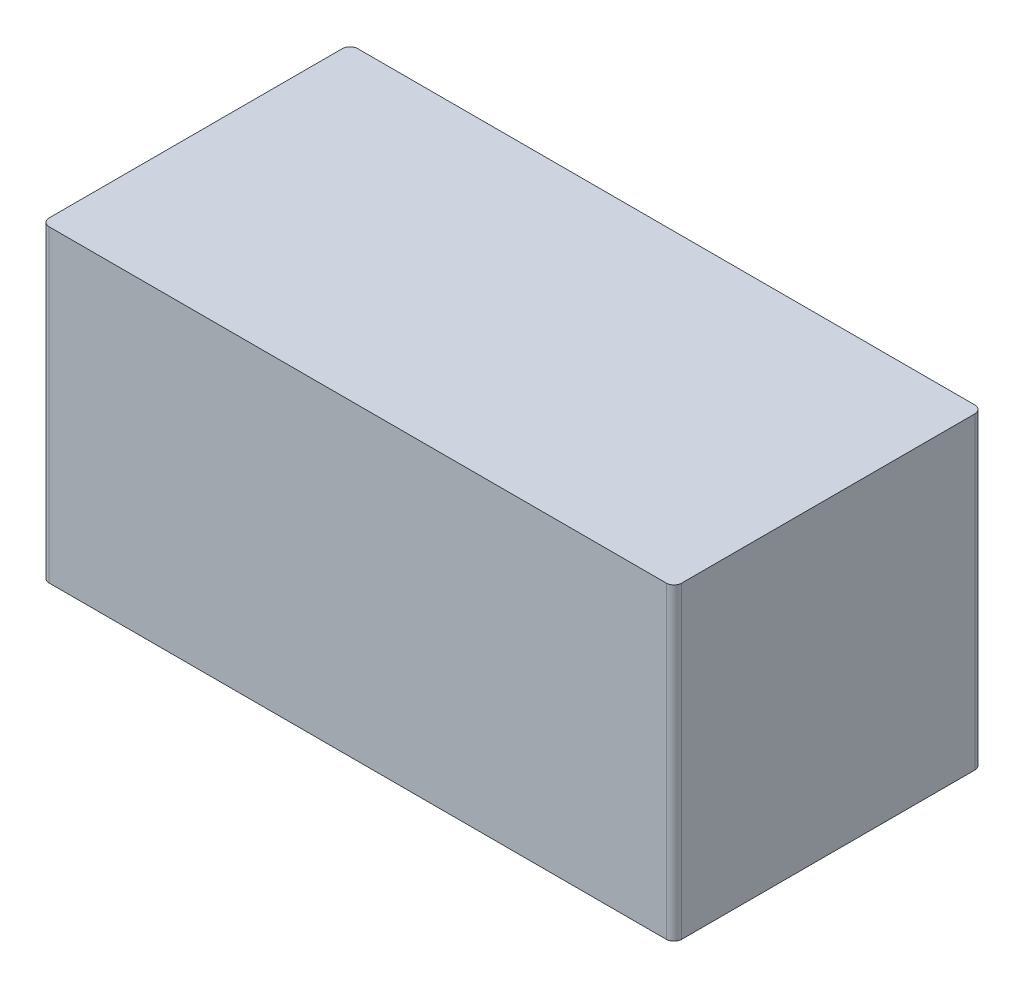
ISO-10303-21;
HEADER;
FILE_DESCRIPTION(('STEP AP214'),'2;1');
FILE_NAME('part.step','',(''),(''),'','','');
FILE_SCHEMA(('AUTOMOTIVE_DESIGN { 1 0 10303 214 1 1 1 1 }'));
ENDSEC;
DATA;
#1=APPLICATION_CONTEXT('core data for automotive mechanical design processes');
#2=APPLICATION_PROTOCOL_DEFINITION('international standard','automotive_design',2000,#1);
#3=PRODUCT_CONTEXT('',#1,'mechanical');
#4=PRODUCT('Part','Part','',(#3));
#5=PRODUCT_RELATED_PRODUCT_CATEGORY('part','',(#4));
#6=PRODUCT_DEFINITION_FORMATION('','',#4);
#7=PRODUCT_DEFINITION_CONTEXT('part definition',#1,'design');
#8=PRODUCT_DEFINITION('design','',#6,#7);
#9=PRODUCT_DEFINITION_SHAPE('','',#8);
#10=(LENGTH_UNIT() NAMED_UNIT(*) SI_UNIT(.MILLI.,.METRE.));
#11=(NAMED_UNIT(*) PLANE_ANGLE_UNIT() SI_UNIT($,.RADIAN.));
#12=(NAMED_UNIT(*) SI_UNIT($,.STERADIAN.) SOLID_ANGLE_UNIT());
#13=UNCERTAINTY_MEASURE_WITH_UNIT(LENGTH_MEASURE(1.E-05),#10,'distance_accuracy_value','');
#14=(GEOMETRIC_REPRESENTATION_CONTEXT(3) GLOBAL_UNCERTAINTY_ASSIGNED_CONTEXT((#13)) GLOBAL_UNIT_ASSIGNED_CONTEXT((#10,
#11,#12)) REPRESENTATION_CONTEXT('',''));
#15=CARTESIAN_POINT('',(0.,0.,0.));
#16=DIRECTION('',(0.,0.,1.));
#17=DIRECTION('',(1.,0.,0.));
#18=AXIS2_PLACEMENT_3D('',#15,#16,#17);
#19=CARTESIAN_POINT('',(0.,20.,-20.));
#20=DIRECTION('',(1.,0.,0.));
#21=DIRECTION('',(0.,0.,-1.));
#22=AXIS2_PLACEMENT_3D('',#19,#20,#21);
#23=PLANE('',#22);
#24=DIRECTION('',(0.,0.,1.));
#25=VECTOR('',#24,1.);
#26=CARTESIAN_POINT('',(0.,20.,-20.));
#27=LINE('',#26,#25);
#28=CARTESIAN_POINT('',(0.,20.,-19.5));
#29=VERTEX_POINT('',#28);
#30=CARTESIAN_POINT('',(0.,20.,-0.5));
#31=VERTEX_POINT('',#30);
#32=EDGE_CURVE('E117',#29,#31,#27,.T.);
#33=ORIENTED_EDGE('',*,*,#32,.F.);
#34=DIRECTION('',(0.,-1.,0.));
#35=VECTOR('',#34,1.);
#36=CARTESIAN_POINT('',(0.,20.,-19.5));
#37=LINE('',#36,#35);
#38=CARTESIAN_POINT('',(0.,0.,-19.5));
#39=VERTEX_POINT('',#38);
#40=EDGE_CURVE('E102',#29,#39,#37,.T.);
#41=ORIENTED_EDGE('',*,*,#40,.T.);
#42=DIRECTION('',(0.,0.,1.));
#43=VECTOR('',#42,1.);
#44=CARTESIAN_POINT('',(0.,0.,-20.));
#45=LINE('',#44,#43);
#46=CARTESIAN_POINT('',(0.,0.,-0.5));
#47=VERTEX_POINT('',#46);
#48=EDGE_CURVE('E114',#39,#47,#45,.T.);
#49=ORIENTED_EDGE('',*,*,#48,.T.);
#50=DIRECTION('',(0.,-1.,0.));
#51=VECTOR('',#50,1.);
#52=CARTESIAN_POINT('',(0.,20.,-0.5));
#53=LINE('',#52,#51);
#54=EDGE_CURVE('E119',#47,#31,#53,.F.);
#55=ORIENTED_EDGE('',*,*,#54,.T.);
#56=EDGE_LOOP('',(#33,#41,#49,#55));
#57=FACE_BOUND('',#56,.T.);
#58=ADVANCED_FACE('F33',(#57),#23,.F.);
#59=CARTESIAN_POINT('',(0.,20.,0.));
#60=DIRECTION('',(0.,0.,-1.));
#61=DIRECTION('',(-1.,0.,0.));
#62=AXIS2_PLACEMENT_3D('',#59,#60,#61);
#63=PLANE('',#62);
#64=DIRECTION('',(1.,0.,0.));
#65=VECTOR('',#64,1.);
#66=CARTESIAN_POINT('',(0.,20.,0.));
#67=LINE('',#66,#65);
#68=CARTESIAN_POINT('',(0.5,20.,0.));
#69=VERTEX_POINT('',#68);
#70=CARTESIAN_POINT('',(40.5,20.,0.));
#71=VERTEX_POINT('',#70);
#72=EDGE_CURVE('E168',#69,#71,#67,.T.);
#73=ORIENTED_EDGE('',*,*,#72,.F.);
#74=DIRECTION('',(0.,-1.,0.));
#75=VECTOR('',#74,1.);
#76=CARTESIAN_POINT('',(0.5,20.,0.));
#77=LINE('',#76,#75);
#78=CARTESIAN_POINT('',(0.5,0.,0.));
#79=VERTEX_POINT('',#78);
#80=EDGE_CURVE('E152',#69,#79,#77,.T.);
#81=ORIENTED_EDGE('',*,*,#80,.T.);
#82=DIRECTION('',(1.,0.,0.));
#83=VECTOR('',#82,1.);
#84=CARTESIAN_POINT('',(0.,0.,0.));
#85=LINE('',#84,#83);
#86=CARTESIAN_POINT('',(40.5,0.,0.));
#87=VERTEX_POINT('',#86);
#88=EDGE_CURVE('E123',#79,#87,#85,.T.);
#89=ORIENTED_EDGE('',*,*,#88,.T.);
#90=DIRECTION('',(0.,-1.,0.));
#91=VECTOR('',#90,1.);
#92=CARTESIAN_POINT('',(40.5,20.,0.));
#93=LINE('',#92,#91);
#94=EDGE_CURVE('E150',#87,#71,#93,.F.);
#95=ORIENTED_EDGE('',*,*,#94,.T.);
#96=EDGE_LOOP('',(#73,#81,#89,#95));
#97=FACE_BOUND('',#96,.T.);
#98=ADVANCED_FACE('F178',(#97),#63,.F.);
#99=CARTESIAN_POINT('',(41.,20.,0.));
#100=DIRECTION('',(-1.,0.,0.));
#101=DIRECTION('',(0.,0.,1.));
#102=AXIS2_PLACEMENT_3D('',#99,#100,#101);
#103=PLANE('',#102);
#104=DIRECTION('',(0.,0.,-1.));
#105=VECTOR('',#104,1.);
#106=CARTESIAN_POINT('',(41.,0.,0.));
#107=LINE('',#106,#105);
#108=CARTESIAN_POINT('',(41.,0.,-0.5));
#109=VERTEX_POINT('',#108);
#110=CARTESIAN_POINT('',(41.,0.,-19.5));
#111=VERTEX_POINT('',#110);
#112=EDGE_CURVE('E126',#109,#111,#107,.T.);
#113=ORIENTED_EDGE('',*,*,#112,.T.);
#114=DIRECTION('',(0.,-1.,0.));
#115=VECTOR('',#114,1.);
#116=CARTESIAN_POINT('',(41.,20.,-19.5));
#117=LINE('',#116,#115);
#118=CARTESIAN_POINT('',(41.,20.,-19.5));
#119=VERTEX_POINT('',#118);
#120=EDGE_CURVE('E11',#111,#119,#117,.F.);
#121=ORIENTED_EDGE('',*,*,#120,.T.);
#122=DIRECTION('',(0.,0.,-1.));
#123=VECTOR('',#122,1.);
#124=CARTESIAN_POINT('',(41.,20.,0.));
#125=LINE('',#124,#123);
#126=CARTESIAN_POINT('',(41.,20.,-0.5));
#127=VERTEX_POINT('',#126);
#128=EDGE_CURVE('E158',#127,#119,#125,.T.);
#129=ORIENTED_EDGE('',*,*,#128,.F.);
#130=DIRECTION('',(0.,-1.,0.));
#131=VECTOR('',#130,1.);
#132=CARTESIAN_POINT('',(41.,20.,-0.5));
#133=LINE('',#132,#131);
#134=EDGE_CURVE('E41',#127,#109,#133,.T.);
#135=ORIENTED_EDGE('',*,*,#134,.T.);
#136=EDGE_LOOP('',(#113,#121,#129,#135));
#137=FACE_BOUND('',#136,.T.);
#138=ADVANCED_FACE('F157',(#137),#103,.F.);
#139=CARTESIAN_POINT('',(41.,20.,-20.));
#140=DIRECTION('',(0.,0.,1.));
#141=DIRECTION('',(1.,0.,0.));
#142=AXIS2_PLACEMENT_3D('',#139,#140,#141);
#143=PLANE('',#142);
#144=DIRECTION('',(-1.,0.,0.));
#145=VECTOR('',#144,1.);
#146=CARTESIAN_POINT('',(41.,0.,-20.));
#147=LINE('',#146,#145);
#148=CARTESIAN_POINT('',(40.5,0.,-20.));
#149=VERTEX_POINT('',#148);
#150=CARTESIAN_POINT('',(0.5,0.,-20.));
#151=VERTEX_POINT('',#150);
#152=EDGE_CURVE('E133',#149,#151,#147,.T.);
#153=ORIENTED_EDGE('',*,*,#152,.T.);
#154=DIRECTION('',(0.,-1.,0.));
#155=VECTOR('',#154,1.);
#156=CARTESIAN_POINT('',(0.5,20.,-20.));
#157=LINE('',#156,#155);
#158=CARTESIAN_POINT('',(0.5,20.,-20.));
#159=VERTEX_POINT('',#158);
#160=EDGE_CURVE('E103',#151,#159,#157,.F.);
#161=ORIENTED_EDGE('',*,*,#160,.T.);
#162=DIRECTION('',(-1.,0.,0.));
#163=VECTOR('',#162,1.);
#164=CARTESIAN_POINT('',(41.,20.,-20.));
#165=LINE('',#164,#163);
#166=CARTESIAN_POINT('',(40.5,20.,-20.));
#167=VERTEX_POINT('',#166);
#168=EDGE_CURVE('E129',#167,#159,#165,.T.);
#169=ORIENTED_EDGE('',*,*,#168,.F.);
#170=DIRECTION('',(0.,-1.,0.));
#171=VECTOR('',#170,1.);
#172=CARTESIAN_POINT('',(40.5,20.,-20.));
#173=LINE('',#172,#171);
#174=EDGE_CURVE('E108',#167,#149,#173,.T.);
#175=ORIENTED_EDGE('',*,*,#174,.T.);
#176=EDGE_LOOP('',(#153,#161,#169,#175));
#177=FACE_BOUND('',#176,.T.);
#178=ADVANCED_FACE('F166',(#177),#143,.F.);
#179=CARTESIAN_POINT('',(0.,20.,0.));
#180=DIRECTION('',(0.,1.,0.));
#181=DIRECTION('',(0.,0.,1.));
#182=AXIS2_PLACEMENT_3D('',#179,#180,#181);
#183=PLANE('',#182);
#184=ORIENTED_EDGE('',*,*,#168,.T.);
#185=CARTESIAN_POINT('',(0.5,20.,-19.5));
#186=DIRECTION('',(0.,1.,0.));
#187=DIRECTION('',(0.,0.,1.));
#188=AXIS2_PLACEMENT_3D('',#185,#186,#187);
#189=CIRCLE('',#188,0.5);
#190=EDGE_CURVE('E148',#159,#29,#189,.T.);
#191=ORIENTED_EDGE('',*,*,#190,.T.);
#192=ORIENTED_EDGE('',*,*,#32,.T.);
#193=CARTESIAN_POINT('',(0.5,20.,-0.5));
#194=DIRECTION('',(0.,1.,0.));
#195=DIRECTION('',(0.,0.,1.));
#196=AXIS2_PLACEMENT_3D('',#193,#194,#195);
#197=CIRCLE('',#196,0.5);
#198=EDGE_CURVE('E146',#31,#69,#197,.T.);
#199=ORIENTED_EDGE('',*,*,#198,.T.);
#200=ORIENTED_EDGE('',*,*,#72,.T.);
#201=CARTESIAN_POINT('',(40.5,20.,-0.5));
#202=DIRECTION('',(0.,1.,0.));
#203=DIRECTION('',(0.,0.,1.));
#204=AXIS2_PLACEMENT_3D('',#201,#202,#203);
#205=CIRCLE('',#204,0.5);
#206=EDGE_CURVE('E53',#71,#127,#205,.T.);
#207=ORIENTED_EDGE('',*,*,#206,.T.);
#208=ORIENTED_EDGE('',*,*,#128,.T.);
#209=CARTESIAN_POINT('',(40.5,20.,-19.5));
#210=DIRECTION('',(0.,1.,0.));
#211=DIRECTION('',(0.,0.,1.));
#212=AXIS2_PLACEMENT_3D('',#209,#210,#211);
#213=CIRCLE('',#212,0.5);
#214=EDGE_CURVE('E144',#119,#167,#213,.T.);
#215=ORIENTED_EDGE('',*,*,#214,.T.);
#216=EDGE_LOOP('',(#184,#191,#192,#199,#200,#207,#208,#215));
#217=FACE_BOUND('',#216,.T.);
#218=ADVANCED_FACE('F172',(#217),#183,.T.);
#219=CARTESIAN_POINT('',(0.,0.,0.));
#220=DIRECTION('',(0.,1.,0.));
#221=DIRECTION('',(0.,0.,1.));
#222=AXIS2_PLACEMENT_3D('',#219,#220,#221);
#223=PLANE('',#222);
#224=ORIENTED_EDGE('',*,*,#48,.F.);
#225=CARTESIAN_POINT('',(0.5,0.,-19.5));
#226=DIRECTION('',(0.,1.,0.));
#227=DIRECTION('',(0.,0.,1.));
#228=AXIS2_PLACEMENT_3D('',#225,#226,#227);
#229=CIRCLE('',#228,0.5);
#230=EDGE_CURVE('E98',#39,#151,#229,.F.);
#231=ORIENTED_EDGE('',*,*,#230,.T.);
#232=ORIENTED_EDGE('',*,*,#152,.F.);
#233=CARTESIAN_POINT('',(40.5,0.,-19.5));
#234=DIRECTION('',(0.,1.,0.));
#235=DIRECTION('',(0.,0.,1.));
#236=AXIS2_PLACEMENT_3D('',#233,#234,#235);
#237=CIRCLE('',#236,0.5);
#238=EDGE_CURVE('E137',#149,#111,#237,.F.);
#239=ORIENTED_EDGE('',*,*,#238,.T.);
#240=ORIENTED_EDGE('',*,*,#112,.F.);
#241=CARTESIAN_POINT('',(40.5,0.,-0.5));
#242=DIRECTION('',(0.,1.,0.));
#243=DIRECTION('',(0.,0.,1.));
#244=AXIS2_PLACEMENT_3D('',#241,#242,#243);
#245=CIRCLE('',#244,0.5);
#246=EDGE_CURVE('E118',#109,#87,#245,.F.);
#247=ORIENTED_EDGE('',*,*,#246,.T.);
#248=ORIENTED_EDGE('',*,*,#88,.F.);
#249=CARTESIAN_POINT('',(0.5,0.,-0.5));
#250=DIRECTION('',(0.,1.,0.));
#251=DIRECTION('',(0.,0.,1.));
#252=AXIS2_PLACEMENT_3D('',#249,#250,#251);
#253=CIRCLE('',#252,0.5);
#254=EDGE_CURVE('E109',#79,#47,#253,.F.);
#255=ORIENTED_EDGE('',*,*,#254,.T.);
#256=EDGE_LOOP('',(#224,#231,#232,#239,#240,#247,#248,#255));
#257=FACE_BOUND('',#256,.T.);
#258=ADVANCED_FACE('F121',(#257),#223,.F.);
#259=CARTESIAN_POINT('',(0.5,20.,-19.5));
#260=DIRECTION('',(0.,-1.,0.));
#261=DIRECTION('',(0.,0.,-1.));
#262=AXIS2_PLACEMENT_3D('',#259,#260,#261);
#263=CYLINDRICAL_SURFACE('',#262,0.5);
#264=ORIENTED_EDGE('',*,*,#190,.F.);
#265=ORIENTED_EDGE('',*,*,#160,.F.);
#266=ORIENTED_EDGE('',*,*,#230,.F.);
#267=ORIENTED_EDGE('',*,*,#40,.F.);
#268=EDGE_LOOP('',(#264,#265,#266,#267));
#269=FACE_BOUND('',#268,.T.);
#270=ADVANCED_FACE('F101',(#269),#263,.T.);
#271=CARTESIAN_POINT('',(0.5,20.,-0.5));
#272=DIRECTION('',(0.,-1.,0.));
#273=DIRECTION('',(0.,0.,-1.));
#274=AXIS2_PLACEMENT_3D('',#271,#272,#273);
#275=CYLINDRICAL_SURFACE('',#274,0.5);
#276=ORIENTED_EDGE('',*,*,#198,.F.);
#277=ORIENTED_EDGE('',*,*,#54,.F.);
#278=ORIENTED_EDGE('',*,*,#254,.F.);
#279=ORIENTED_EDGE('',*,*,#80,.F.);
#280=EDGE_LOOP('',(#276,#277,#278,#279));
#281=FACE_BOUND('',#280,.T.);
#282=ADVANCED_FACE('F176',(#281),#275,.T.);
#283=CARTESIAN_POINT('',(40.5,20.,-19.5));
#284=DIRECTION('',(0.,-1.,0.));
#285=DIRECTION('',(0.,0.,-1.));
#286=AXIS2_PLACEMENT_3D('',#283,#284,#285);
#287=CYLINDRICAL_SURFACE('',#286,0.5);
#288=ORIENTED_EDGE('',*,*,#214,.F.);
#289=ORIENTED_EDGE('',*,*,#120,.F.);
#290=ORIENTED_EDGE('',*,*,#238,.F.);
#291=ORIENTED_EDGE('',*,*,#174,.F.);
#292=EDGE_LOOP('',(#288,#289,#290,#291));
#293=FACE_BOUND('',#292,.T.);
#294=ADVANCED_FACE('F163',(#293),#287,.T.);
#295=CARTESIAN_POINT('',(40.5,20.,-0.5));
#296=DIRECTION('',(0.,-1.,0.));
#297=DIRECTION('',(0.,0.,-1.));
#298=AXIS2_PLACEMENT_3D('',#295,#296,#297);
#299=CYLINDRICAL_SURFACE('',#298,0.5);
#300=ORIENTED_EDGE('',*,*,#206,.F.);
#301=ORIENTED_EDGE('',*,*,#94,.F.);
#302=ORIENTED_EDGE('',*,*,#246,.F.);
#303=ORIENTED_EDGE('',*,*,#134,.F.);
#304=EDGE_LOOP('',(#300,#301,#302,#303));
#305=FACE_BOUND('',#304,.T.);
#306=ADVANCED_FACE('F35',(#305),#299,.T.);
#307=CLOSED_SHELL('',(#58,#98,#138,#178,#218,#258,#270,#282,#294,#306));
#308=MANIFOLD_SOLID_BREP('B2',#307);
#309=ADVANCED_BREP_SHAPE_REPRESENTATION('',(#18,#308),#14);
#310=SHAPE_DEFINITION_REPRESENTATION(#9,#309);
ENDSEC;
END-ISO-10303-21;
